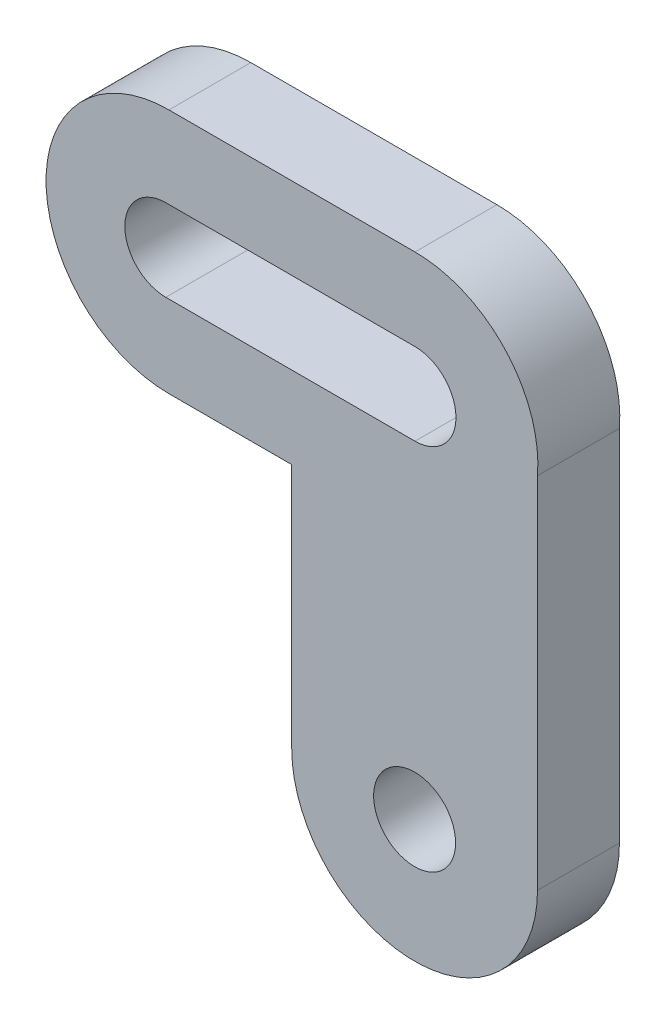
ISO-10303-21;
HEADER;
FILE_DESCRIPTION(('STEP AP214'),'2;1');
FILE_NAME('part.step','',(''),(''),'','','');
FILE_SCHEMA(('AUTOMOTIVE_DESIGN { 1 0 10303 214 1 1 1 1 }'));
ENDSEC;
DATA;
#1=APPLICATION_CONTEXT('core data for automotive mechanical design processes');
#2=APPLICATION_PROTOCOL_DEFINITION('international standard','automotive_design',2000,#1);
#3=PRODUCT_CONTEXT('',#1,'mechanical');
#4=PRODUCT('Part','Part','',(#3));
#5=PRODUCT_RELATED_PRODUCT_CATEGORY('part','',(#4));
#6=PRODUCT_DEFINITION_FORMATION('','',#4);
#7=PRODUCT_DEFINITION_CONTEXT('part definition',#1,'design');
#8=PRODUCT_DEFINITION('design','',#6,#7);
#9=PRODUCT_DEFINITION_SHAPE('','',#8);
#10=(LENGTH_UNIT() NAMED_UNIT(*) SI_UNIT(.MILLI.,.METRE.));
#11=(NAMED_UNIT(*) PLANE_ANGLE_UNIT() SI_UNIT($,.RADIAN.));
#12=(NAMED_UNIT(*) SI_UNIT($,.STERADIAN.) SOLID_ANGLE_UNIT());
#13=UNCERTAINTY_MEASURE_WITH_UNIT(LENGTH_MEASURE(1.E-05),#10,'distance_accuracy_value','');
#14=(GEOMETRIC_REPRESENTATION_CONTEXT(3) GLOBAL_UNCERTAINTY_ASSIGNED_CONTEXT((#13)) GLOBAL_UNIT_ASSIGNED_CONTEXT((#10,
#11,#12)) REPRESENTATION_CONTEXT('',''));
#15=CARTESIAN_POINT('',(0.,0.,0.));
#16=DIRECTION('',(0.,0.,1.));
#17=DIRECTION('',(1.,0.,0.));
#18=AXIS2_PLACEMENT_3D('',#15,#16,#17);
#19=CARTESIAN_POINT('',(156.2128865511,239.8700734832,3.));
#20=DIRECTION('',(0.,0.,-1.));
#21=DIRECTION('',(-1.,0.,0.));
#22=AXIS2_PLACEMENT_3D('',#19,#20,#21);
#23=CYLINDRICAL_SURFACE('',#22,1.5);
#24=CARTESIAN_POINT('',(156.2128865511,239.8700734832,0.));
#25=DIRECTION('',(0.,0.,1.));
#26=DIRECTION('',(1.,0.,0.));
#27=AXIS2_PLACEMENT_3D('',#24,#25,#26);
#28=CIRCLE('',#27,1.5);
#29=CARTESIAN_POINT('',(156.2128865511,238.3700734832,0.));
#30=VERTEX_POINT('',#29);
#31=CARTESIAN_POINT('',(156.2128865511,241.3700734832,0.));
#32=VERTEX_POINT('',#31);
#33=EDGE_CURVE('E172',#30,#32,#28,.T.);
#34=ORIENTED_EDGE('',*,*,#33,.F.);
#35=DIRECTION('',(0.,0.,-1.));
#36=VECTOR('',#35,1.);
#37=CARTESIAN_POINT('',(156.2128865511,238.3700734832,3.));
#38=LINE('',#37,#36);
#39=CARTESIAN_POINT('',(156.2128865511,238.3700734832,3.));
#40=VERTEX_POINT('',#39);
#41=EDGE_CURVE('E11',#40,#30,#38,.T.);
#42=ORIENTED_EDGE('',*,*,#41,.F.);
#43=CARTESIAN_POINT('',(156.2128865511,239.8700734832,3.));
#44=DIRECTION('',(0.,0.,1.));
#45=DIRECTION('',(1.,0.,0.));
#46=AXIS2_PLACEMENT_3D('',#43,#44,#45);
#47=CIRCLE('',#46,1.5);
#48=CARTESIAN_POINT('',(156.2128865511,241.3700734832,3.));
#49=VERTEX_POINT('',#48);
#50=EDGE_CURVE('E140',#40,#49,#47,.T.);
#51=ORIENTED_EDGE('',*,*,#50,.T.);
#52=DIRECTION('',(0.,0.,-1.));
#53=VECTOR('',#52,1.);
#54=CARTESIAN_POINT('',(156.2128865511,241.3700734832,3.));
#55=LINE('',#54,#53);
#56=EDGE_CURVE('E95',#49,#32,#55,.T.);
#57=ORIENTED_EDGE('',*,*,#56,.T.);
#58=EDGE_LOOP('',(#34,#42,#51,#57));
#59=FACE_BOUND('',#58,.T.);
#60=ADVANCED_FACE('F33',(#59),#23,.F.);
#61=CARTESIAN_POINT('',(0.,238.3700734832,3.));
#62=DIRECTION('',(0.,1.,0.));
#63=DIRECTION('',(0.,0.,1.));
#64=AXIS2_PLACEMENT_3D('',#61,#62,#63);
#65=PLANE('',#64);
#66=DIRECTION('',(1.,0.,0.));
#67=VECTOR('',#66,1.);
#68=CARTESIAN_POINT('',(0.,238.3700734832,0.));
#69=LINE('',#68,#67);
#70=CARTESIAN_POINT('',(147.0878865511,238.3700734832,0.));
#71=VERTEX_POINT('',#70);
#72=EDGE_CURVE('E131',#71,#30,#69,.T.);
#73=ORIENTED_EDGE('',*,*,#72,.F.);
#74=DIRECTION('',(0.,0.,-1.));
#75=VECTOR('',#74,1.);
#76=CARTESIAN_POINT('',(147.0878865511,238.3700734832,3.));
#77=LINE('',#76,#75);
#78=CARTESIAN_POINT('',(147.0878865511,238.3700734832,3.));
#79=VERTEX_POINT('',#78);
#80=EDGE_CURVE('E43',#79,#71,#77,.T.);
#81=ORIENTED_EDGE('',*,*,#80,.F.);
#82=DIRECTION('',(1.,0.,0.));
#83=VECTOR('',#82,1.);
#84=CARTESIAN_POINT('',(0.,238.3700734832,3.));
#85=LINE('',#84,#83);
#86=EDGE_CURVE('E129',#79,#40,#85,.T.);
#87=ORIENTED_EDGE('',*,*,#86,.T.);
#88=ORIENTED_EDGE('',*,*,#41,.T.);
#89=EDGE_LOOP('',(#73,#81,#87,#88));
#90=FACE_BOUND('',#89,.T.);
#91=ADVANCED_FACE('F128',(#90),#65,.T.);
#92=CARTESIAN_POINT('',(147.0878865511,239.8700734832,3.));
#93=DIRECTION('',(0.,0.,-1.));
#94=DIRECTION('',(-1.,0.,0.));
#95=AXIS2_PLACEMENT_3D('',#92,#93,#94);
#96=CYLINDRICAL_SURFACE('',#95,1.5);
#97=CARTESIAN_POINT('',(147.0878865511,239.8700734832,0.));
#98=DIRECTION('',(0.,0.,1.));
#99=DIRECTION('',(1.,0.,0.));
#100=AXIS2_PLACEMENT_3D('',#97,#98,#99);
#101=CIRCLE('',#100,1.5);
#102=CARTESIAN_POINT('',(147.0878865511,241.3700734832,0.));
#103=VERTEX_POINT('',#102);
#104=EDGE_CURVE('E176',#103,#71,#101,.T.);
#105=ORIENTED_EDGE('',*,*,#104,.F.);
#106=DIRECTION('',(0.,0.,-1.));
#107=VECTOR('',#106,1.);
#108=CARTESIAN_POINT('',(147.0878865511,241.3700734832,3.));
#109=LINE('',#108,#107);
#110=CARTESIAN_POINT('',(147.0878865511,241.3700734832,3.));
#111=VERTEX_POINT('',#110);
#112=EDGE_CURVE('E88',#111,#103,#109,.T.);
#113=ORIENTED_EDGE('',*,*,#112,.F.);
#114=CARTESIAN_POINT('',(147.0878865511,239.8700734832,3.));
#115=DIRECTION('',(0.,0.,1.));
#116=DIRECTION('',(1.,0.,0.));
#117=AXIS2_PLACEMENT_3D('',#114,#115,#116);
#118=CIRCLE('',#117,1.5);
#119=EDGE_CURVE('E139',#111,#79,#118,.T.);
#120=ORIENTED_EDGE('',*,*,#119,.T.);
#121=ORIENTED_EDGE('',*,*,#80,.T.);
#122=EDGE_LOOP('',(#105,#113,#120,#121));
#123=FACE_BOUND('',#122,.T.);
#124=ADVANCED_FACE('F142',(#123),#96,.F.);
#125=CARTESIAN_POINT('',(160.6989262173,0.,3.));
#126=DIRECTION('',(1.,0.,0.));
#127=DIRECTION('',(0.,0.,-1.));
#128=AXIS2_PLACEMENT_3D('',#125,#126,#127);
#129=PLANE('',#128);
#130=DIRECTION('',(0.,-1.,0.));
#131=VECTOR('',#130,1.);
#132=CARTESIAN_POINT('',(160.6989262173,0.,0.));
#133=LINE('',#132,#131);
#134=CARTESIAN_POINT('',(160.6989262173,239.515886931676,0.));
#135=VERTEX_POINT('',#134);
#136=CARTESIAN_POINT('',(160.6989262173,226.3700734832,0.));
#137=VERTEX_POINT('',#136);
#138=EDGE_CURVE('E151',#135,#137,#133,.T.);
#139=ORIENTED_EDGE('',*,*,#138,.F.);
#140=DIRECTION('',(0.,0.,-1.));
#141=VECTOR('',#140,1.);
#142=CARTESIAN_POINT('',(160.6989262173,239.515886931676,3.));
#143=LINE('',#142,#141);
#144=CARTESIAN_POINT('',(160.6989262173,239.515886931676,3.));
#145=VERTEX_POINT('',#144);
#146=EDGE_CURVE('E37',#145,#135,#143,.T.);
#147=ORIENTED_EDGE('',*,*,#146,.F.);
#148=DIRECTION('',(0.,-1.,0.));
#149=VECTOR('',#148,1.);
#150=CARTESIAN_POINT('',(160.6989262173,0.,3.));
#151=LINE('',#150,#149);
#152=CARTESIAN_POINT('',(160.6989262173,226.3700734832,3.));
#153=VERTEX_POINT('',#152);
#154=EDGE_CURVE('E183',#145,#153,#151,.T.);
#155=ORIENTED_EDGE('',*,*,#154,.T.);
#156=DIRECTION('',(0.,0.,-1.));
#157=VECTOR('',#156,1.);
#158=CARTESIAN_POINT('',(160.6989262173,226.3700734832,3.));
#159=LINE('',#158,#157);
#160=EDGE_CURVE('E150',#153,#137,#159,.T.);
#161=ORIENTED_EDGE('',*,*,#160,.T.);
#162=EDGE_LOOP('',(#139,#147,#155,#161));
#163=FACE_BOUND('',#162,.T.);
#164=ADVANCED_FACE('F35',(#163),#129,.T.);
#165=CARTESIAN_POINT('',(156.2128865511,239.8700734832,3.));
#166=DIRECTION('',(0.,0.,-1.));
#167=DIRECTION('',(-1.,0.,0.));
#168=AXIS2_PLACEMENT_3D('',#165,#166,#167);
#169=CYLINDRICAL_SURFACE('',#168,4.5);
#170=CARTESIAN_POINT('',(156.2128865511,239.8700734832,0.));
#171=DIRECTION('',(0.,0.,1.));
#172=DIRECTION('',(1.,0.,0.));
#173=AXIS2_PLACEMENT_3D('',#170,#171,#172);
#174=CIRCLE('',#173,4.5);
#175=CARTESIAN_POINT('',(156.2128865511,244.3700734832,0.));
#176=VERTEX_POINT('',#175);
#177=EDGE_CURVE('E154',#135,#176,#174,.T.);
#178=ORIENTED_EDGE('',*,*,#177,.T.);
#179=DIRECTION('',(0.,0.,-1.));
#180=VECTOR('',#179,1.);
#181=CARTESIAN_POINT('',(156.2128865511,244.3700734832,3.));
#182=LINE('',#181,#180);
#183=CARTESIAN_POINT('',(156.2128865511,244.3700734832,3.));
#184=VERTEX_POINT('',#183);
#185=EDGE_CURVE('E194',#184,#176,#182,.T.);
#186=ORIENTED_EDGE('',*,*,#185,.F.);
#187=CARTESIAN_POINT('',(156.2128865511,239.8700734832,3.));
#188=DIRECTION('',(0.,0.,1.));
#189=DIRECTION('',(1.,0.,0.));
#190=AXIS2_PLACEMENT_3D('',#187,#188,#189);
#191=CIRCLE('',#190,4.5);
#192=EDGE_CURVE('E202',#145,#184,#191,.T.);
#193=ORIENTED_EDGE('',*,*,#192,.F.);
#194=ORIENTED_EDGE('',*,*,#146,.T.);
#195=EDGE_LOOP('',(#178,#186,#193,#194));
#196=FACE_BOUND('',#195,.T.);
#197=ADVANCED_FACE('F201',(#196),#169,.T.);
#198=CARTESIAN_POINT('',(0.,244.3700734832,3.));
#199=DIRECTION('',(0.,1.,0.));
#200=DIRECTION('',(0.,0.,1.));
#201=AXIS2_PLACEMENT_3D('',#198,#199,#200);
#202=PLANE('',#201);
#203=DIRECTION('',(1.,0.,0.));
#204=VECTOR('',#203,1.);
#205=CARTESIAN_POINT('',(0.,244.3700734832,0.));
#206=LINE('',#205,#204);
#207=CARTESIAN_POINT('',(147.2028865511,244.3700734832,0.));
#208=VERTEX_POINT('',#207);
#209=EDGE_CURVE('E157',#208,#176,#206,.T.);
#210=ORIENTED_EDGE('',*,*,#209,.F.);
#211=DIRECTION('',(0.,0.,-1.));
#212=VECTOR('',#211,1.);
#213=CARTESIAN_POINT('',(147.2028865511,244.3700734832,3.));
#214=LINE('',#213,#212);
#215=CARTESIAN_POINT('',(147.2028865511,244.3700734832,3.));
#216=VERTEX_POINT('',#215);
#217=EDGE_CURVE('E193',#216,#208,#214,.T.);
#218=ORIENTED_EDGE('',*,*,#217,.F.);
#219=DIRECTION('',(1.,0.,0.));
#220=VECTOR('',#219,1.);
#221=CARTESIAN_POINT('',(0.,244.3700734832,3.));
#222=LINE('',#221,#220);
#223=EDGE_CURVE('E229',#216,#184,#222,.T.);
#224=ORIENTED_EDGE('',*,*,#223,.T.);
#225=ORIENTED_EDGE('',*,*,#185,.T.);
#226=EDGE_LOOP('',(#210,#218,#224,#225));
#227=FACE_BOUND('',#226,.T.);
#228=ADVANCED_FACE('F226',(#227),#202,.T.);
#229=CARTESIAN_POINT('',(147.2028865511,239.8700734832,3.));
#230=DIRECTION('',(0.,0.,-1.));
#231=DIRECTION('',(-1.,0.,0.));
#232=AXIS2_PLACEMENT_3D('',#229,#230,#231);
#233=CYLINDRICAL_SURFACE('',#232,4.49999999999999);
#234=CARTESIAN_POINT('',(147.2028865511,239.8700734832,0.));
#235=DIRECTION('',(0.,0.,1.));
#236=DIRECTION('',(1.,0.,0.));
#237=AXIS2_PLACEMENT_3D('',#234,#235,#236);
#238=CIRCLE('',#237,4.49999999999999);
#239=CARTESIAN_POINT('',(147.2028865511,235.3700734832,0.));
#240=VERTEX_POINT('',#239);
#241=EDGE_CURVE('E160',#208,#240,#238,.T.);
#242=ORIENTED_EDGE('',*,*,#241,.T.);
#243=DIRECTION('',(0.,0.,-1.));
#244=VECTOR('',#243,1.);
#245=CARTESIAN_POINT('',(147.2028865511,235.3700734832,3.));
#246=LINE('',#245,#244);
#247=CARTESIAN_POINT('',(147.2028865511,235.3700734832,3.));
#248=VERTEX_POINT('',#247);
#249=EDGE_CURVE('E191',#248,#240,#246,.T.);
#250=ORIENTED_EDGE('',*,*,#249,.F.);
#251=CARTESIAN_POINT('',(147.2028865511,239.8700734832,3.));
#252=DIRECTION('',(0.,0.,1.));
#253=DIRECTION('',(1.,0.,0.));
#254=AXIS2_PLACEMENT_3D('',#251,#252,#253);
#255=CIRCLE('',#254,4.49999999999999);
#256=EDGE_CURVE('E230',#216,#248,#255,.T.);
#257=ORIENTED_EDGE('',*,*,#256,.F.);
#258=ORIENTED_EDGE('',*,*,#217,.T.);
#259=EDGE_LOOP('',(#242,#250,#257,#258));
#260=FACE_BOUND('',#259,.T.);
#261=ADVANCED_FACE('F231',(#260),#233,.T.);
#262=CARTESIAN_POINT('',(0.,235.3700734832,3.));
#263=DIRECTION('',(0.,-1.,0.));
#264=DIRECTION('',(0.,0.,-1.));
#265=AXIS2_PLACEMENT_3D('',#262,#263,#264);
#266=PLANE('',#265);
#267=DIRECTION('',(-1.,0.,0.));
#268=VECTOR('',#267,1.);
#269=CARTESIAN_POINT('',(0.,235.3700734832,0.));
#270=LINE('',#269,#268);
#271=CARTESIAN_POINT('',(151.6989262173,235.3700734832,0.));
#272=VERTEX_POINT('',#271);
#273=EDGE_CURVE('E163',#272,#240,#270,.T.);
#274=ORIENTED_EDGE('',*,*,#273,.F.);
#275=DIRECTION('',(0.,0.,-1.));
#276=VECTOR('',#275,1.);
#277=CARTESIAN_POINT('',(151.6989262173,235.3700734832,3.));
#278=LINE('',#277,#276);
#279=CARTESIAN_POINT('',(151.6989262173,235.3700734832,3.));
#280=VERTEX_POINT('',#279);
#281=EDGE_CURVE('E189',#280,#272,#278,.T.);
#282=ORIENTED_EDGE('',*,*,#281,.F.);
#283=DIRECTION('',(-1.,0.,0.));
#284=VECTOR('',#283,1.);
#285=CARTESIAN_POINT('',(0.,235.3700734832,3.));
#286=LINE('',#285,#284);
#287=EDGE_CURVE('E233',#280,#248,#286,.T.);
#288=ORIENTED_EDGE('',*,*,#287,.T.);
#289=ORIENTED_EDGE('',*,*,#249,.T.);
#290=EDGE_LOOP('',(#274,#282,#288,#289));
#291=FACE_BOUND('',#290,.T.);
#292=ADVANCED_FACE('F223',(#291),#266,.T.);
#293=CARTESIAN_POINT('',(151.6989262173,0.,3.));
#294=DIRECTION('',(-1.,0.,0.));
#295=DIRECTION('',(0.,0.,1.));
#296=AXIS2_PLACEMENT_3D('',#293,#294,#295);
#297=PLANE('',#296);
#298=DIRECTION('',(0.,1.,0.));
#299=VECTOR('',#298,1.);
#300=CARTESIAN_POINT('',(151.6989262173,0.,0.));
#301=LINE('',#300,#299);
#302=CARTESIAN_POINT('',(151.6989262173,226.3700734832,0.));
#303=VERTEX_POINT('',#302);
#304=EDGE_CURVE('E166',#303,#272,#301,.T.);
#305=ORIENTED_EDGE('',*,*,#304,.F.);
#306=DIRECTION('',(0.,0.,-1.));
#307=VECTOR('',#306,1.);
#308=CARTESIAN_POINT('',(151.6989262173,226.3700734832,3.));
#309=LINE('',#308,#307);
#310=CARTESIAN_POINT('',(151.6989262173,226.3700734832,3.));
#311=VERTEX_POINT('',#310);
#312=EDGE_CURVE('E187',#311,#303,#309,.T.);
#313=ORIENTED_EDGE('',*,*,#312,.F.);
#314=DIRECTION('',(0.,1.,0.));
#315=VECTOR('',#314,1.);
#316=CARTESIAN_POINT('',(151.6989262173,0.,3.));
#317=LINE('',#316,#315);
#318=EDGE_CURVE('E219',#311,#280,#317,.T.);
#319=ORIENTED_EDGE('',*,*,#318,.T.);
#320=ORIENTED_EDGE('',*,*,#281,.T.);
#321=EDGE_LOOP('',(#305,#313,#319,#320));
#322=FACE_BOUND('',#321,.T.);
#323=ADVANCED_FACE('F215',(#322),#297,.T.);
#324=CARTESIAN_POINT('',(0.,241.3700734832,3.));
#325=DIRECTION('',(0.,1.,0.));
#326=DIRECTION('',(0.,0.,1.));
#327=AXIS2_PLACEMENT_3D('',#324,#325,#326);
#328=PLANE('',#327);
#329=DIRECTION('',(1.,0.,0.));
#330=VECTOR('',#329,1.);
#331=CARTESIAN_POINT('',(0.,241.3700734832,0.));
#332=LINE('',#331,#330);
#333=EDGE_CURVE('E178',#103,#32,#332,.T.);
#334=ORIENTED_EDGE('',*,*,#333,.T.);
#335=ORIENTED_EDGE('',*,*,#56,.F.);
#336=DIRECTION('',(1.,0.,0.));
#337=VECTOR('',#336,1.);
#338=CARTESIAN_POINT('',(0.,241.3700734832,3.));
#339=LINE('',#338,#337);
#340=EDGE_CURVE('E52',#111,#49,#339,.T.);
#341=ORIENTED_EDGE('',*,*,#340,.F.);
#342=ORIENTED_EDGE('',*,*,#112,.T.);
#343=EDGE_LOOP('',(#334,#335,#341,#342));
#344=FACE_BOUND('',#343,.T.);
#345=ADVANCED_FACE('F243',(#344),#328,.F.);
#346=CARTESIAN_POINT('',(156.1989262173,226.3700734832,3.));
#347=DIRECTION('',(0.,0.,-1.));
#348=DIRECTION('',(-1.,0.,0.));
#349=AXIS2_PLACEMENT_3D('',#346,#347,#348);
#350=CYLINDRICAL_SURFACE('',#349,4.5);
#351=CARTESIAN_POINT('',(156.1989262173,226.3700734832,0.));
#352=DIRECTION('',(0.,0.,1.));
#353=DIRECTION('',(1.,0.,0.));
#354=AXIS2_PLACEMENT_3D('',#351,#352,#353);
#355=CIRCLE('',#354,4.5);
#356=EDGE_CURVE('E169',#303,#137,#355,.T.);
#357=ORIENTED_EDGE('',*,*,#356,.T.);
#358=ORIENTED_EDGE('',*,*,#160,.F.);
#359=CARTESIAN_POINT('',(156.1989262173,226.3700734832,3.));
#360=DIRECTION('',(0.,0.,1.));
#361=DIRECTION('',(1.,0.,0.));
#362=AXIS2_PLACEMENT_3D('',#359,#360,#361);
#363=CIRCLE('',#362,4.5);
#364=EDGE_CURVE('E241',#311,#153,#363,.T.);
#365=ORIENTED_EDGE('',*,*,#364,.F.);
#366=ORIENTED_EDGE('',*,*,#312,.T.);
#367=EDGE_LOOP('',(#357,#358,#365,#366));
#368=FACE_BOUND('',#367,.T.);
#369=ADVANCED_FACE('F212',(#368),#350,.T.);
#370=CARTESIAN_POINT('',(156.1989262173,226.3700734832,3.));
#371=DIRECTION('',(0.,0.,-1.));
#372=DIRECTION('',(-1.,0.,0.));
#373=AXIS2_PLACEMENT_3D('',#370,#371,#372);
#374=CYLINDRICAL_SURFACE('',#373,1.5);
#375=CARTESIAN_POINT('',(156.1989262173,226.3700734832,3.));
#376=DIRECTION('',(0.,0.,1.));
#377=DIRECTION('',(1.,0.,0.));
#378=AXIS2_PLACEMENT_3D('',#375,#376,#377);
#379=CIRCLE('',#378,1.5);
#380=CARTESIAN_POINT('',(157.6989262173,226.3700734832,3.));
#381=VERTEX_POINT('',#380);
#382=EDGE_CURVE('E144',#381,#381,#379,.T.);
#383=ORIENTED_EDGE('',*,*,#382,.T.);
#384=EDGE_LOOP('',(#383));
#385=FACE_BOUND('',#384,.T.);
#386=CARTESIAN_POINT('',(156.1989262173,226.3700734832,0.));
#387=DIRECTION('',(0.,0.,1.));
#388=DIRECTION('',(1.,0.,0.));
#389=AXIS2_PLACEMENT_3D('',#386,#387,#388);
#390=CIRCLE('',#389,1.5);
#391=CARTESIAN_POINT('',(157.6989262173,226.3700734832,0.));
#392=VERTEX_POINT('',#391);
#393=EDGE_CURVE('E180',#392,#392,#390,.T.);
#394=ORIENTED_EDGE('',*,*,#393,.F.);
#395=EDGE_LOOP('',(#394));
#396=FACE_BOUND('',#395,.T.);
#397=ADVANCED_FACE('F250',(#385,#396),#374,.F.);
#398=CARTESIAN_POINT('',(0.,0.,3.));
#399=DIRECTION('',(0.,0.,1.));
#400=DIRECTION('',(1.,0.,0.));
#401=AXIS2_PLACEMENT_3D('',#398,#399,#400);
#402=PLANE('',#401);
#403=ORIENTED_EDGE('',*,*,#154,.F.);
#404=ORIENTED_EDGE('',*,*,#192,.T.);
#405=ORIENTED_EDGE('',*,*,#223,.F.);
#406=ORIENTED_EDGE('',*,*,#256,.T.);
#407=ORIENTED_EDGE('',*,*,#287,.F.);
#408=ORIENTED_EDGE('',*,*,#318,.F.);
#409=ORIENTED_EDGE('',*,*,#364,.T.);
#410=EDGE_LOOP('',(#403,#404,#405,#406,#407,#408,#409));
#411=FACE_BOUND('',#410,.T.);
#412=ORIENTED_EDGE('',*,*,#50,.F.);
#413=ORIENTED_EDGE('',*,*,#86,.F.);
#414=ORIENTED_EDGE('',*,*,#119,.F.);
#415=ORIENTED_EDGE('',*,*,#340,.T.);
#416=EDGE_LOOP('',(#412,#413,#414,#415));
#417=FACE_BOUND('',#416,.T.);
#418=ORIENTED_EDGE('',*,*,#382,.F.);
#419=EDGE_LOOP('',(#418));
#420=FACE_BOUND('',#419,.T.);
#421=ADVANCED_FACE('F137',(#411,#417,#420),#402,.T.);
#422=CARTESIAN_POINT('',(0.,0.,0.));
#423=DIRECTION('',(0.,0.,1.));
#424=DIRECTION('',(1.,0.,0.));
#425=AXIS2_PLACEMENT_3D('',#422,#423,#424);
#426=PLANE('',#425);
#427=ORIENTED_EDGE('',*,*,#138,.T.);
#428=ORIENTED_EDGE('',*,*,#356,.F.);
#429=ORIENTED_EDGE('',*,*,#304,.T.);
#430=ORIENTED_EDGE('',*,*,#273,.T.);
#431=ORIENTED_EDGE('',*,*,#241,.F.);
#432=ORIENTED_EDGE('',*,*,#209,.T.);
#433=ORIENTED_EDGE('',*,*,#177,.F.);
#434=EDGE_LOOP('',(#427,#428,#429,#430,#431,#432,#433));
#435=FACE_BOUND('',#434,.T.);
#436=ORIENTED_EDGE('',*,*,#33,.T.);
#437=ORIENTED_EDGE('',*,*,#333,.F.);
#438=ORIENTED_EDGE('',*,*,#104,.T.);
#439=ORIENTED_EDGE('',*,*,#72,.T.);
#440=EDGE_LOOP('',(#436,#437,#438,#439));
#441=FACE_BOUND('',#440,.T.);
#442=ORIENTED_EDGE('',*,*,#393,.T.);
#443=EDGE_LOOP('',(#442));
#444=FACE_BOUND('',#443,.T.);
#445=ADVANCED_FACE('F205',(#435,#441,#444),#426,.F.);
#446=CLOSED_SHELL('',(#60,#91,#124,#164,#197,#228,#261,#292,#323,#345,#369,#397,#421,#445));
#447=MANIFOLD_SOLID_BREP('B2',#446);
#448=ADVANCED_BREP_SHAPE_REPRESENTATION('',(#18,#447),#14);
#449=SHAPE_DEFINITION_REPRESENTATION(#9,#448);
ENDSEC;
END-ISO-10303-21;
